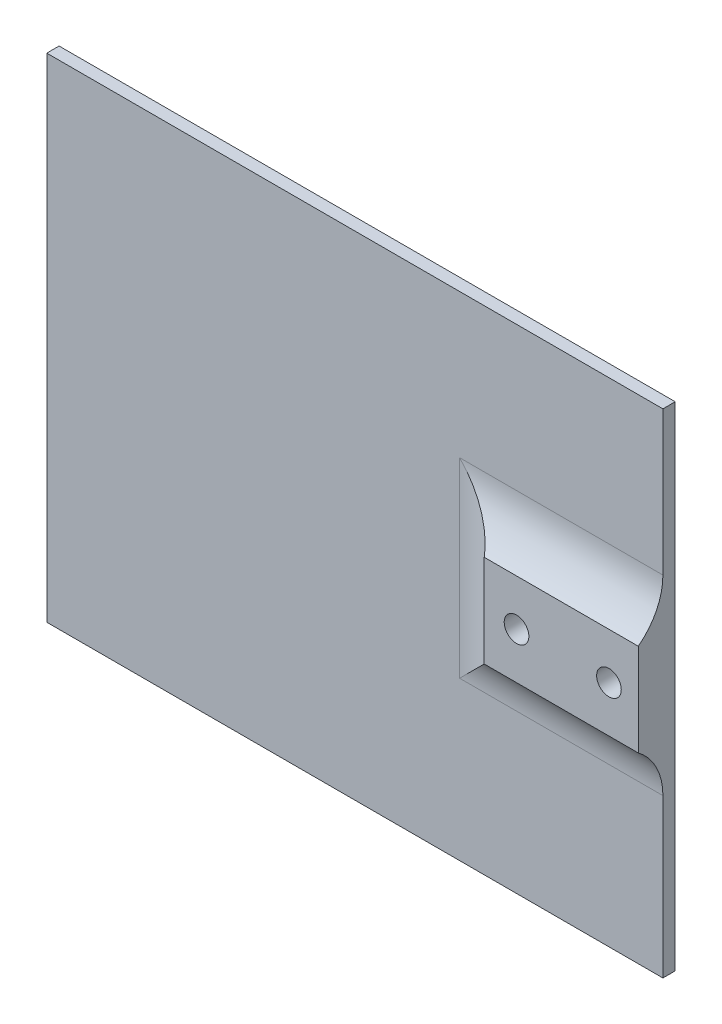
ISO-10303-21;
HEADER;
FILE_DESCRIPTION(('STEP AP214'),'2;1');
FILE_NAME('part.step','',(''),(''),'','','');
FILE_SCHEMA(('AUTOMOTIVE_DESIGN { 1 0 10303 214 1 1 1 1 }'));
ENDSEC;
DATA;
#1=APPLICATION_CONTEXT('core data for automotive mechanical design processes');
#2=APPLICATION_PROTOCOL_DEFINITION('international standard','automotive_design',2000,#1);
#3=PRODUCT_CONTEXT('',#1,'mechanical');
#4=PRODUCT('Part','Part','',(#3));
#5=PRODUCT_RELATED_PRODUCT_CATEGORY('part','',(#4));
#6=PRODUCT_DEFINITION_FORMATION('','',#4);
#7=PRODUCT_DEFINITION_CONTEXT('part definition',#1,'design');
#8=PRODUCT_DEFINITION('design','',#6,#7);
#9=PRODUCT_DEFINITION_SHAPE('','',#8);
#10=(LENGTH_UNIT() NAMED_UNIT(*) SI_UNIT(.MILLI.,.METRE.));
#11=(NAMED_UNIT(*) PLANE_ANGLE_UNIT() SI_UNIT($,.RADIAN.));
#12=(NAMED_UNIT(*) SI_UNIT($,.STERADIAN.) SOLID_ANGLE_UNIT());
#13=UNCERTAINTY_MEASURE_WITH_UNIT(LENGTH_MEASURE(1.E-05),#10,'distance_accuracy_value','');
#14=(GEOMETRIC_REPRESENTATION_CONTEXT(3) GLOBAL_UNCERTAINTY_ASSIGNED_CONTEXT((#13)) GLOBAL_UNIT_ASSIGNED_CONTEXT((#10,
#11,#12)) REPRESENTATION_CONTEXT('',''));
#15=CARTESIAN_POINT('',(0.,0.,0.));
#16=DIRECTION('',(0.,0.,1.));
#17=DIRECTION('',(1.,0.,0.));
#18=AXIS2_PLACEMENT_3D('',#15,#16,#17);
#19=CARTESIAN_POINT('',(0.,0.,2.));
#20=DIRECTION('',(0.,0.,-1.));
#21=DIRECTION('',(-1.,0.,0.));
#22=AXIS2_PLACEMENT_3D('',#19,#20,#21);
#23=PLANE('',#22);
#24=DIRECTION('',(0.,-1.,0.));
#25=VECTOR('',#24,1.);
#26=CARTESIAN_POINT('',(67.,0.,2.));
#27=LINE('',#26,#25);
#28=CARTESIAN_POINT('',(67.,25.6370451809671,2.));
#29=VERTEX_POINT('',#28);
#30=CARTESIAN_POINT('',(67.,56.6370451809671,2.));
#31=VERTEX_POINT('',#30);
#32=EDGE_CURVE('E57',#29,#31,#27,.F.);
#33=ORIENTED_EDGE('',*,*,#32,.T.);
#34=DIRECTION('',(-1.,0.,0.));
#35=VECTOR('',#34,1.);
#36=CARTESIAN_POINT('',(0.,56.6370451809671,2.));
#37=LINE('',#36,#35);
#38=CARTESIAN_POINT('',(100.,56.6370451809671,2.));
#39=VERTEX_POINT('',#38);
#40=EDGE_CURVE('E116',#31,#39,#37,.F.);
#41=ORIENTED_EDGE('',*,*,#40,.T.);
#42=DIRECTION('',(0.,1.,0.));
#43=VECTOR('',#42,1.);
#44=CARTESIAN_POINT('',(100.,0.,2.));
#45=LINE('',#44,#43);
#46=CARTESIAN_POINT('',(100.,80.,2.));
#47=VERTEX_POINT('',#46);
#48=EDGE_CURVE('E112',#39,#47,#45,.T.);
#49=ORIENTED_EDGE('',*,*,#48,.T.);
#50=DIRECTION('',(-1.,0.,0.));
#51=VECTOR('',#50,1.);
#52=CARTESIAN_POINT('',(0.,80.,2.));
#53=LINE('',#52,#51);
#54=CARTESIAN_POINT('',(0.,80.,2.));
#55=VERTEX_POINT('',#54);
#56=EDGE_CURVE('E152',#47,#55,#53,.T.);
#57=ORIENTED_EDGE('',*,*,#56,.T.);
#58=DIRECTION('',(0.,-1.,0.));
#59=VECTOR('',#58,1.);
#60=CARTESIAN_POINT('',(0.,0.,2.));
#61=LINE('',#60,#59);
#62=CARTESIAN_POINT('',(0.,0.,2.));
#63=VERTEX_POINT('',#62);
#64=EDGE_CURVE('E141',#55,#63,#61,.T.);
#65=ORIENTED_EDGE('',*,*,#64,.T.);
#66=DIRECTION('',(1.,0.,0.));
#67=VECTOR('',#66,1.);
#68=CARTESIAN_POINT('',(0.,0.,2.));
#69=LINE('',#68,#67);
#70=CARTESIAN_POINT('',(100.,0.,2.));
#71=VERTEX_POINT('',#70);
#72=EDGE_CURVE('E145',#63,#71,#69,.T.);
#73=ORIENTED_EDGE('',*,*,#72,.T.);
#74=CARTESIAN_POINT('',(100.,25.6370451809671,2.));
#75=VERTEX_POINT('',#74);
#76=EDGE_CURVE('E149',#71,#75,#45,.T.);
#77=ORIENTED_EDGE('',*,*,#76,.T.);
#78=DIRECTION('',(1.,0.,0.));
#79=VECTOR('',#78,1.);
#80=CARTESIAN_POINT('',(0.,25.6370451809671,2.));
#81=LINE('',#80,#79);
#82=EDGE_CURVE('E62',#75,#29,#81,.F.);
#83=ORIENTED_EDGE('',*,*,#82,.T.);
#84=EDGE_LOOP('',(#33,#41,#49,#57,#65,#73,#77,#83));
#85=FACE_BOUND('',#84,.T.);
#86=ADVANCED_FACE('F39',(#85),#23,.F.);
#87=CARTESIAN_POINT('',(0.,0.,2.));
#88=DIRECTION('',(1.,0.,0.));
#89=DIRECTION('',(0.,0.,-1.));
#90=AXIS2_PLACEMENT_3D('',#87,#88,#89);
#91=PLANE('',#90);
#92=DIRECTION('',(0.,-1.,0.));
#93=VECTOR('',#92,1.);
#94=CARTESIAN_POINT('',(0.,0.,0.));
#95=LINE('',#94,#93);
#96=CARTESIAN_POINT('',(0.,80.,0.));
#97=VERTEX_POINT('',#96);
#98=CARTESIAN_POINT('',(0.,0.,0.));
#99=VERTEX_POINT('',#98);
#100=EDGE_CURVE('E140',#97,#99,#95,.T.);
#101=ORIENTED_EDGE('',*,*,#100,.T.);
#102=DIRECTION('',(0.,0.,-1.));
#103=VECTOR('',#102,1.);
#104=CARTESIAN_POINT('',(0.,0.,2.));
#105=LINE('',#104,#103);
#106=EDGE_CURVE('E178',#63,#99,#105,.T.);
#107=ORIENTED_EDGE('',*,*,#106,.F.);
#108=ORIENTED_EDGE('',*,*,#64,.F.);
#109=DIRECTION('',(0.,0.,-1.));
#110=VECTOR('',#109,1.);
#111=CARTESIAN_POINT('',(0.,80.,2.));
#112=LINE('',#111,#110);
#113=EDGE_CURVE('E155',#55,#97,#112,.T.);
#114=ORIENTED_EDGE('',*,*,#113,.T.);
#115=EDGE_LOOP('',(#101,#107,#108,#114));
#116=FACE_BOUND('',#115,.T.);
#117=ADVANCED_FACE('F232',(#116),#91,.F.);
#118=CARTESIAN_POINT('',(0.,0.,2.));
#119=DIRECTION('',(0.,1.,0.));
#120=DIRECTION('',(0.,0.,1.));
#121=AXIS2_PLACEMENT_3D('',#118,#119,#120);
#122=PLANE('',#121);
#123=DIRECTION('',(1.,0.,0.));
#124=VECTOR('',#123,1.);
#125=CARTESIAN_POINT('',(0.,0.,0.));
#126=LINE('',#125,#124);
#127=CARTESIAN_POINT('',(100.,0.,0.));
#128=VERTEX_POINT('',#127);
#129=EDGE_CURVE('E159',#99,#128,#126,.T.);
#130=ORIENTED_EDGE('',*,*,#129,.T.);
#131=DIRECTION('',(0.,0.,-1.));
#132=VECTOR('',#131,1.);
#133=CARTESIAN_POINT('',(100.,0.,2.));
#134=LINE('',#133,#132);
#135=EDGE_CURVE('E174',#71,#128,#134,.T.);
#136=ORIENTED_EDGE('',*,*,#135,.F.);
#137=ORIENTED_EDGE('',*,*,#72,.F.);
#138=ORIENTED_EDGE('',*,*,#106,.T.);
#139=EDGE_LOOP('',(#130,#136,#137,#138));
#140=FACE_BOUND('',#139,.T.);
#141=ADVANCED_FACE('F236',(#140),#122,.F.);
#142=CARTESIAN_POINT('',(100.,0.,2.));
#143=DIRECTION('',(-1.,0.,0.));
#144=DIRECTION('',(0.,0.,1.));
#145=AXIS2_PLACEMENT_3D('',#142,#143,#144);
#146=PLANE('',#145);
#147=DIRECTION('',(0.,1.,0.));
#148=VECTOR('',#147,1.);
#149=CARTESIAN_POINT('',(100.,0.,0.));
#150=LINE('',#149,#148);
#151=CARTESIAN_POINT('',(100.,80.,0.));
#152=VERTEX_POINT('',#151);
#153=EDGE_CURVE('E162',#128,#152,#150,.T.);
#154=ORIENTED_EDGE('',*,*,#153,.T.);
#155=DIRECTION('',(0.,0.,-1.));
#156=VECTOR('',#155,1.);
#157=CARTESIAN_POINT('',(100.,80.,2.));
#158=LINE('',#157,#156);
#159=EDGE_CURVE('E170',#47,#152,#158,.T.);
#160=ORIENTED_EDGE('',*,*,#159,.F.);
#161=ORIENTED_EDGE('',*,*,#48,.F.);
#162=CARTESIAN_POINT('',(100.,56.6370451809671,12.));
#163=DIRECTION('',(-1.,0.,0.));
#164=DIRECTION('',(0.,0.,1.));
#165=AXIS2_PLACEMENT_3D('',#162,#163,#164);
#166=CIRCLE('',#165,10.);
#167=CARTESIAN_POINT('',(100.,48.6370451809671,6.));
#168=VERTEX_POINT('',#167);
#169=EDGE_CURVE('E49',#39,#168,#166,.T.);
#170=ORIENTED_EDGE('',*,*,#169,.T.);
#171=DIRECTION('',(0.,1.,0.));
#172=VECTOR('',#171,1.);
#173=CARTESIAN_POINT('',(100.,33.6370451809671,6.));
#174=LINE('',#173,#172);
#175=CARTESIAN_POINT('',(100.,33.6370451809671,6.));
#176=VERTEX_POINT('',#175);
#177=EDGE_CURVE('E109',#176,#168,#174,.T.);
#178=ORIENTED_EDGE('',*,*,#177,.F.);
#179=CARTESIAN_POINT('',(100.,25.6370451809671,12.));
#180=DIRECTION('',(-1.,0.,0.));
#181=DIRECTION('',(0.,0.,1.));
#182=AXIS2_PLACEMENT_3D('',#179,#180,#181);
#183=CIRCLE('',#182,10.);
#184=EDGE_CURVE('E11',#176,#75,#183,.T.);
#185=ORIENTED_EDGE('',*,*,#184,.T.);
#186=ORIENTED_EDGE('',*,*,#76,.F.);
#187=ORIENTED_EDGE('',*,*,#135,.T.);
#188=EDGE_LOOP('',(#154,#160,#161,#170,#178,#185,#186,#187));
#189=FACE_BOUND('',#188,.T.);
#190=ADVANCED_FACE('F108',(#189),#146,.F.);
#191=CARTESIAN_POINT('',(0.,80.,2.));
#192=DIRECTION('',(0.,-1.,0.));
#193=DIRECTION('',(0.,0.,-1.));
#194=AXIS2_PLACEMENT_3D('',#191,#192,#193);
#195=PLANE('',#194);
#196=DIRECTION('',(-1.,0.,0.));
#197=VECTOR('',#196,1.);
#198=CARTESIAN_POINT('',(0.,80.,0.));
#199=LINE('',#198,#197);
#200=EDGE_CURVE('E146',#152,#97,#199,.T.);
#201=ORIENTED_EDGE('',*,*,#200,.T.);
#202=ORIENTED_EDGE('',*,*,#113,.F.);
#203=ORIENTED_EDGE('',*,*,#56,.F.);
#204=ORIENTED_EDGE('',*,*,#159,.T.);
#205=EDGE_LOOP('',(#201,#202,#203,#204));
#206=FACE_BOUND('',#205,.T.);
#207=ADVANCED_FACE('F228',(#206),#195,.F.);
#208=CARTESIAN_POINT('',(0.,0.,0.));
#209=DIRECTION('',(0.,0.,-1.));
#210=DIRECTION('',(-1.,0.,0.));
#211=AXIS2_PLACEMENT_3D('',#208,#209,#210);
#212=PLANE('',#211);
#213=CARTESIAN_POINT('',(80.2429144220795,41.1370451809671,0.));
#214=DIRECTION('',(0.,0.,1.));
#215=DIRECTION('',(1.,0.,0.));
#216=AXIS2_PLACEMENT_3D('',#213,#214,#215);
#217=CIRCLE('',#216,2.);
#218=CARTESIAN_POINT('',(82.2429144220795,41.1370451809671,0.));
#219=VERTEX_POINT('',#218);
#220=EDGE_CURVE('E125',#219,#219,#217,.T.);
#221=ORIENTED_EDGE('',*,*,#220,.T.);
#222=EDGE_LOOP('',(#221));
#223=FACE_BOUND('',#222,.T.);
#224=CARTESIAN_POINT('',(95.2429144220795,41.1370451809671,0.));
#225=DIRECTION('',(0.,0.,1.));
#226=DIRECTION('',(1.,0.,0.));
#227=AXIS2_PLACEMENT_3D('',#224,#225,#226);
#228=CIRCLE('',#227,2.);
#229=CARTESIAN_POINT('',(97.2429144220795,41.1370451809671,0.));
#230=VERTEX_POINT('',#229);
#231=EDGE_CURVE('E194',#230,#230,#228,.T.);
#232=ORIENTED_EDGE('',*,*,#231,.T.);
#233=EDGE_LOOP('',(#232));
#234=FACE_BOUND('',#233,.T.);
#235=ORIENTED_EDGE('',*,*,#100,.F.);
#236=ORIENTED_EDGE('',*,*,#200,.F.);
#237=ORIENTED_EDGE('',*,*,#153,.F.);
#238=ORIENTED_EDGE('',*,*,#129,.F.);
#239=EDGE_LOOP('',(#235,#236,#237,#238));
#240=FACE_BOUND('',#239,.T.);
#241=ADVANCED_FACE('F209',(#223,#234,#240),#212,.T.);
#242=CARTESIAN_POINT('',(0.,0.,6.));
#243=DIRECTION('',(0.,0.,1.));
#244=DIRECTION('',(1.,0.,0.));
#245=AXIS2_PLACEMENT_3D('',#242,#243,#244);
#246=PLANE('',#245);
#247=CARTESIAN_POINT('',(80.2429144220795,41.1370451809671,6.));
#248=DIRECTION('',(0.,0.,1.));
#249=DIRECTION('',(1.,0.,0.));
#250=AXIS2_PLACEMENT_3D('',#247,#248,#249);
#251=CIRCLE('',#250,2.);
#252=CARTESIAN_POINT('',(82.2429144220795,41.1370451809671,6.));
#253=VERTEX_POINT('',#252);
#254=EDGE_CURVE('E199',#253,#253,#251,.T.);
#255=ORIENTED_EDGE('',*,*,#254,.F.);
#256=EDGE_LOOP('',(#255));
#257=FACE_BOUND('',#256,.T.);
#258=CARTESIAN_POINT('',(95.2429144220795,41.1370451809671,6.));
#259=DIRECTION('',(0.,0.,1.));
#260=DIRECTION('',(1.,0.,0.));
#261=AXIS2_PLACEMENT_3D('',#258,#259,#260);
#262=CIRCLE('',#261,2.);
#263=CARTESIAN_POINT('',(97.2429144220795,41.1370451809671,6.));
#264=VERTEX_POINT('',#263);
#265=EDGE_CURVE('E190',#264,#264,#262,.T.);
#266=ORIENTED_EDGE('',*,*,#265,.F.);
#267=EDGE_LOOP('',(#266));
#268=FACE_BOUND('',#267,.T.);
#269=ORIENTED_EDGE('',*,*,#177,.T.);
#270=DIRECTION('',(-1.,0.,0.));
#271=VECTOR('',#270,1.);
#272=CARTESIAN_POINT('',(100.,48.6370451809671,6.));
#273=LINE('',#272,#271);
#274=CARTESIAN_POINT('',(75.,48.6370451809671,6.));
#275=VERTEX_POINT('',#274);
#276=EDGE_CURVE('E121',#168,#275,#273,.T.);
#277=ORIENTED_EDGE('',*,*,#276,.T.);
#278=DIRECTION('',(0.,-1.,0.));
#279=VECTOR('',#278,1.);
#280=CARTESIAN_POINT('',(75.,33.6370451809671,6.));
#281=LINE('',#280,#279);
#282=CARTESIAN_POINT('',(75.,33.6370451809671,6.));
#283=VERTEX_POINT('',#282);
#284=EDGE_CURVE('E132',#275,#283,#281,.T.);
#285=ORIENTED_EDGE('',*,*,#284,.T.);
#286=DIRECTION('',(1.,0.,0.));
#287=VECTOR('',#286,1.);
#288=CARTESIAN_POINT('',(100.,33.6370451809671,6.));
#289=LINE('',#288,#287);
#290=EDGE_CURVE('E123',#283,#176,#289,.T.);
#291=ORIENTED_EDGE('',*,*,#290,.T.);
#292=EDGE_LOOP('',(#269,#277,#285,#291));
#293=FACE_BOUND('',#292,.T.);
#294=ADVANCED_FACE('F120',(#257,#268,#293),#246,.T.);
#295=CARTESIAN_POINT('',(95.2429144220795,41.1370451809671,0.));
#296=DIRECTION('',(0.,0.,1.));
#297=DIRECTION('',(1.,0.,0.));
#298=AXIS2_PLACEMENT_3D('',#295,#296,#297);
#299=CYLINDRICAL_SURFACE('',#298,2.);
#300=ORIENTED_EDGE('',*,*,#231,.F.);
#301=EDGE_LOOP('',(#300));
#302=FACE_BOUND('',#301,.T.);
#303=ORIENTED_EDGE('',*,*,#265,.T.);
#304=EDGE_LOOP('',(#303));
#305=FACE_BOUND('',#304,.T.);
#306=ADVANCED_FACE('F215',(#302,#305),#299,.F.);
#307=CARTESIAN_POINT('',(80.2429144220795,41.1370451809671,0.));
#308=DIRECTION('',(0.,0.,1.));
#309=DIRECTION('',(1.,0.,0.));
#310=AXIS2_PLACEMENT_3D('',#307,#308,#309);
#311=CYLINDRICAL_SURFACE('',#310,2.);
#312=ORIENTED_EDGE('',*,*,#220,.F.);
#313=EDGE_LOOP('',(#312));
#314=FACE_BOUND('',#313,.T.);
#315=ORIENTED_EDGE('',*,*,#254,.T.);
#316=EDGE_LOOP('',(#315));
#317=FACE_BOUND('',#316,.T.);
#318=ADVANCED_FACE('F212',(#314,#317),#311,.F.);
#319=CARTESIAN_POINT('',(100.,25.6370451809671,12.));
#320=DIRECTION('',(1.,0.,0.));
#321=DIRECTION('',(0.,1.,0.));
#322=AXIS2_PLACEMENT_3D('',#319,#320,#321);
#323=CYLINDRICAL_SURFACE('',#322,10.);
#324=ORIENTED_EDGE('',*,*,#184,.F.);
#325=ORIENTED_EDGE('',*,*,#290,.F.);
#326=CARTESIAN_POINT('',(67.,25.6370451809671,12.));
#327=DIRECTION('',(0.707106781186548,-0.707106781186547,0.));
#328=DIRECTION('',(0.707106781186547,0.707106781186548,0.));
#329=AXIS2_PLACEMENT_3D('',#326,#327,#328);
#330=ELLIPSE('',#329,14.142135623731,10.);
#331=EDGE_CURVE('E43',#29,#283,#330,.T.);
#332=ORIENTED_EDGE('',*,*,#331,.F.);
#333=ORIENTED_EDGE('',*,*,#82,.F.);
#334=EDGE_LOOP('',(#324,#325,#332,#333));
#335=FACE_BOUND('',#334,.T.);
#336=ADVANCED_FACE('F41',(#335),#323,.F.);
#337=CARTESIAN_POINT('',(67.,33.6370451809671,12.));
#338=DIRECTION('',(0.,-1.,0.));
#339=DIRECTION('',(0.,0.,-1.));
#340=AXIS2_PLACEMENT_3D('',#337,#338,#339);
#341=CYLINDRICAL_SURFACE('',#340,10.);
#342=ORIENTED_EDGE('',*,*,#331,.T.);
#343=ORIENTED_EDGE('',*,*,#284,.F.);
#344=CARTESIAN_POINT('',(67.,56.6370451809671,12.));
#345=DIRECTION('',(-0.707106781186547,-0.707106781186548,0.));
#346=DIRECTION('',(0.707106781186548,-0.707106781186547,0.));
#347=AXIS2_PLACEMENT_3D('',#344,#345,#346);
#348=ELLIPSE('',#347,14.1421356237309,10.);
#349=EDGE_CURVE('E129',#31,#275,#348,.T.);
#350=ORIENTED_EDGE('',*,*,#349,.F.);
#351=ORIENTED_EDGE('',*,*,#32,.F.);
#352=EDGE_LOOP('',(#342,#343,#350,#351));
#353=FACE_BOUND('',#352,.T.);
#354=ADVANCED_FACE('F249',(#353),#341,.F.);
#355=CARTESIAN_POINT('',(100.,56.6370451809671,12.));
#356=DIRECTION('',(-1.,0.,0.));
#357=DIRECTION('',(0.,-1.,0.));
#358=AXIS2_PLACEMENT_3D('',#355,#356,#357);
#359=CYLINDRICAL_SURFACE('',#358,10.);
#360=ORIENTED_EDGE('',*,*,#169,.F.);
#361=ORIENTED_EDGE('',*,*,#40,.F.);
#362=ORIENTED_EDGE('',*,*,#349,.T.);
#363=ORIENTED_EDGE('',*,*,#276,.F.);
#364=EDGE_LOOP('',(#360,#361,#362,#363));
#365=FACE_BOUND('',#364,.T.);
#366=ADVANCED_FACE('F127',(#365),#359,.F.);
#367=CLOSED_SHELL('',(#86,#117,#141,#190,#207,#241,#294,#306,#318,#336,#354,#366));
#368=MANIFOLD_SOLID_BREP('B2',#367);
#369=ADVANCED_BREP_SHAPE_REPRESENTATION('',(#18,#368),#14);
#370=SHAPE_DEFINITION_REPRESENTATION(#9,#369);
ENDSEC;
END-ISO-10303-21;
